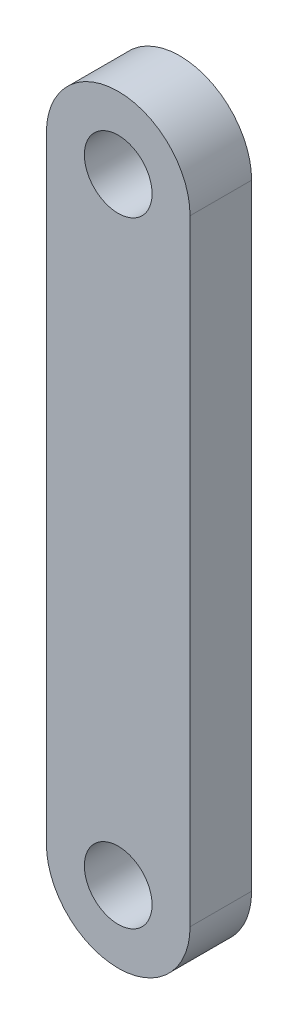
ISO-10303-21;
HEADER;
FILE_DESCRIPTION(('STEP AP214'),'2;1');
FILE_NAME('part.step','',(''),(''),'','','');
FILE_SCHEMA(('AUTOMOTIVE_DESIGN { 1 0 10303 214 1 1 1 1 }'));
ENDSEC;
DATA;
#1=APPLICATION_CONTEXT('core data for automotive mechanical design processes');
#2=APPLICATION_PROTOCOL_DEFINITION('international standard','automotive_design',2000,#1);
#3=PRODUCT_CONTEXT('',#1,'mechanical');
#4=PRODUCT('Part','Part','',(#3));
#5=PRODUCT_RELATED_PRODUCT_CATEGORY('part','',(#4));
#6=PRODUCT_DEFINITION_FORMATION('','',#4);
#7=PRODUCT_DEFINITION_CONTEXT('part definition',#1,'design');
#8=PRODUCT_DEFINITION('design','',#6,#7);
#9=PRODUCT_DEFINITION_SHAPE('','',#8);
#10=(LENGTH_UNIT() NAMED_UNIT(*) SI_UNIT(.MILLI.,.METRE.));
#11=(NAMED_UNIT(*) PLANE_ANGLE_UNIT() SI_UNIT($,.RADIAN.));
#12=(NAMED_UNIT(*) SI_UNIT($,.STERADIAN.) SOLID_ANGLE_UNIT());
#13=UNCERTAINTY_MEASURE_WITH_UNIT(LENGTH_MEASURE(1.E-05),#10,'distance_accuracy_value','');
#14=(GEOMETRIC_REPRESENTATION_CONTEXT(3) GLOBAL_UNCERTAINTY_ASSIGNED_CONTEXT((#13)) GLOBAL_UNIT_ASSIGNED_CONTEXT((#10,
#11,#12)) REPRESENTATION_CONTEXT('',''));
#15=CARTESIAN_POINT('',(0.,0.,0.));
#16=DIRECTION('',(0.,0.,1.));
#17=DIRECTION('',(1.,0.,0.));
#18=AXIS2_PLACEMENT_3D('',#15,#16,#17);
#19=CARTESIAN_POINT('',(0.,15.,3.));
#20=DIRECTION('',(0.,0.,1.));
#21=DIRECTION('',(1.,0.,0.));
#22=AXIS2_PLACEMENT_3D('',#19,#20,#21);
#23=PLANE('',#22);
#24=CARTESIAN_POINT('',(0.,15.,3.));
#25=DIRECTION('',(0.,0.,1.));
#26=DIRECTION('',(1.,0.,0.));
#27=AXIS2_PLACEMENT_3D('',#24,#25,#26);
#28=CIRCLE('',#27,1.65);
#29=CARTESIAN_POINT('',(1.64999999999999,15.,3.));
#30=VERTEX_POINT('',#29);
#31=EDGE_CURVE('E116',#30,#30,#28,.T.);
#32=ORIENTED_EDGE('',*,*,#31,.F.);
#33=EDGE_LOOP('',(#32));
#34=FACE_BOUND('',#33,.T.);
#35=CARTESIAN_POINT('',(0.,15.,3.));
#36=DIRECTION('',(0.,0.,1.));
#37=DIRECTION('',(1.,0.,0.));
#38=AXIS2_PLACEMENT_3D('',#35,#36,#37);
#39=CIRCLE('',#38,3.5);
#40=CARTESIAN_POINT('',(3.49999999999999,15.,3.));
#41=VERTEX_POINT('',#40);
#42=CARTESIAN_POINT('',(-3.50000000000001,15.,3.));
#43=VERTEX_POINT('',#42);
#44=EDGE_CURVE('E96',#41,#43,#39,.T.);
#45=ORIENTED_EDGE('',*,*,#44,.T.);
#46=DIRECTION('',(0.,-1.,0.));
#47=VECTOR('',#46,1.);
#48=CARTESIAN_POINT('',(-3.50000000000001,15.,3.));
#49=LINE('',#48,#47);
#50=CARTESIAN_POINT('',(-3.5,-15.,3.));
#51=VERTEX_POINT('',#50);
#52=EDGE_CURVE('E91',#43,#51,#49,.T.);
#53=ORIENTED_EDGE('',*,*,#52,.T.);
#54=CARTESIAN_POINT('',(0.,-15.,3.));
#55=DIRECTION('',(0.,0.,1.));
#56=DIRECTION('',(1.,0.,0.));
#57=AXIS2_PLACEMENT_3D('',#54,#55,#56);
#58=CIRCLE('',#57,3.5);
#59=CARTESIAN_POINT('',(3.5,-15.,3.));
#60=VERTEX_POINT('',#59);
#61=EDGE_CURVE('E94',#51,#60,#58,.T.);
#62=ORIENTED_EDGE('',*,*,#61,.T.);
#63=DIRECTION('',(0.,1.,0.));
#64=VECTOR('',#63,1.);
#65=CARTESIAN_POINT('',(3.49999999999999,15.,3.));
#66=LINE('',#65,#64);
#67=EDGE_CURVE('E61',#60,#41,#66,.T.);
#68=ORIENTED_EDGE('',*,*,#67,.T.);
#69=EDGE_LOOP('',(#45,#53,#62,#68));
#70=FACE_BOUND('',#69,.T.);
#71=CARTESIAN_POINT('',(0.,-15.,3.));
#72=DIRECTION('',(0.,0.,1.));
#73=DIRECTION('',(1.,0.,0.));
#74=AXIS2_PLACEMENT_3D('',#71,#72,#73);
#75=CIRCLE('',#74,1.65);
#76=CARTESIAN_POINT('',(1.65,-15.,3.));
#77=VERTEX_POINT('',#76);
#78=EDGE_CURVE('E138',#77,#77,#75,.T.);
#79=ORIENTED_EDGE('',*,*,#78,.F.);
#80=EDGE_LOOP('',(#79));
#81=FACE_BOUND('',#80,.T.);
#82=ADVANCED_FACE('F43',(#34,#70,#81),#23,.T.);
#83=CARTESIAN_POINT('',(0.,15.,0.));
#84=DIRECTION('',(0.,0.,1.));
#85=DIRECTION('',(1.,0.,0.));
#86=AXIS2_PLACEMENT_3D('',#83,#84,#85);
#87=PLANE('',#86);
#88=CARTESIAN_POINT('',(0.,15.,0.));
#89=DIRECTION('',(0.,0.,1.));
#90=DIRECTION('',(1.,0.,0.));
#91=AXIS2_PLACEMENT_3D('',#88,#89,#90);
#92=CIRCLE('',#91,3.5);
#93=CARTESIAN_POINT('',(3.49999999999999,15.,0.));
#94=VERTEX_POINT('',#93);
#95=CARTESIAN_POINT('',(-3.50000000000001,15.,0.));
#96=VERTEX_POINT('',#95);
#97=EDGE_CURVE('E112',#94,#96,#92,.T.);
#98=ORIENTED_EDGE('',*,*,#97,.F.);
#99=DIRECTION('',(0.,1.,0.));
#100=VECTOR('',#99,1.);
#101=CARTESIAN_POINT('',(3.49999999999999,15.,0.));
#102=LINE('',#101,#100);
#103=CARTESIAN_POINT('',(3.5,-15.,0.));
#104=VERTEX_POINT('',#103);
#105=EDGE_CURVE('E84',#104,#94,#102,.T.);
#106=ORIENTED_EDGE('',*,*,#105,.F.);
#107=CARTESIAN_POINT('',(0.,-15.,0.));
#108=DIRECTION('',(0.,0.,1.));
#109=DIRECTION('',(1.,0.,0.));
#110=AXIS2_PLACEMENT_3D('',#107,#108,#109);
#111=CIRCLE('',#110,3.5);
#112=CARTESIAN_POINT('',(-3.5,-15.,0.));
#113=VERTEX_POINT('',#112);
#114=EDGE_CURVE('E78',#113,#104,#111,.T.);
#115=ORIENTED_EDGE('',*,*,#114,.F.);
#116=DIRECTION('',(0.,-1.,0.));
#117=VECTOR('',#116,1.);
#118=CARTESIAN_POINT('',(-3.50000000000001,15.,0.));
#119=LINE('',#118,#117);
#120=EDGE_CURVE('E101',#96,#113,#119,.T.);
#121=ORIENTED_EDGE('',*,*,#120,.F.);
#122=EDGE_LOOP('',(#98,#106,#115,#121));
#123=FACE_BOUND('',#122,.T.);
#124=CARTESIAN_POINT('',(0.,15.,0.));
#125=DIRECTION('',(0.,0.,1.));
#126=DIRECTION('',(1.,0.,0.));
#127=AXIS2_PLACEMENT_3D('',#124,#125,#126);
#128=CIRCLE('',#127,1.65);
#129=CARTESIAN_POINT('',(1.64999999999999,15.,0.));
#130=VERTEX_POINT('',#129);
#131=EDGE_CURVE('E134',#130,#130,#128,.T.);
#132=ORIENTED_EDGE('',*,*,#131,.T.);
#133=EDGE_LOOP('',(#132));
#134=FACE_BOUND('',#133,.T.);
#135=CARTESIAN_POINT('',(0.,-15.,0.));
#136=DIRECTION('',(0.,0.,1.));
#137=DIRECTION('',(1.,0.,0.));
#138=AXIS2_PLACEMENT_3D('',#135,#136,#137);
#139=CIRCLE('',#138,1.65);
#140=CARTESIAN_POINT('',(1.65,-15.,0.));
#141=VERTEX_POINT('',#140);
#142=EDGE_CURVE('E142',#141,#141,#139,.T.);
#143=ORIENTED_EDGE('',*,*,#142,.T.);
#144=EDGE_LOOP('',(#143));
#145=FACE_BOUND('',#144,.T.);
#146=ADVANCED_FACE('F129',(#123,#134,#145),#87,.F.);
#147=CARTESIAN_POINT('',(0.,15.,3.));
#148=DIRECTION('',(0.,0.,-1.));
#149=DIRECTION('',(-1.,0.,0.));
#150=AXIS2_PLACEMENT_3D('',#147,#148,#149);
#151=CYLINDRICAL_SURFACE('',#150,3.5);
#152=ORIENTED_EDGE('',*,*,#97,.T.);
#153=DIRECTION('',(0.,0.,-1.));
#154=VECTOR('',#153,1.);
#155=CARTESIAN_POINT('',(-3.50000000000001,15.,3.));
#156=LINE('',#155,#154);
#157=EDGE_CURVE('E11',#43,#96,#156,.T.);
#158=ORIENTED_EDGE('',*,*,#157,.F.);
#159=ORIENTED_EDGE('',*,*,#44,.F.);
#160=DIRECTION('',(0.,0.,-1.));
#161=VECTOR('',#160,1.);
#162=CARTESIAN_POINT('',(3.49999999999999,15.,3.));
#163=LINE('',#162,#161);
#164=EDGE_CURVE('E108',#41,#94,#163,.T.);
#165=ORIENTED_EDGE('',*,*,#164,.T.);
#166=EDGE_LOOP('',(#152,#158,#159,#165));
#167=FACE_BOUND('',#166,.T.);
#168=ADVANCED_FACE('F45',(#167),#151,.T.);
#169=CARTESIAN_POINT('',(-3.50000000000001,15.,3.));
#170=DIRECTION('',(1.,0.,0.));
#171=DIRECTION('',(0.,1.,0.));
#172=AXIS2_PLACEMENT_3D('',#169,#170,#171);
#173=PLANE('',#172);
#174=ORIENTED_EDGE('',*,*,#120,.T.);
#175=DIRECTION('',(0.,0.,-1.));
#176=VECTOR('',#175,1.);
#177=CARTESIAN_POINT('',(-3.5,-15.,3.));
#178=LINE('',#177,#176);
#179=EDGE_CURVE('E53',#51,#113,#178,.T.);
#180=ORIENTED_EDGE('',*,*,#179,.F.);
#181=ORIENTED_EDGE('',*,*,#52,.F.);
#182=ORIENTED_EDGE('',*,*,#157,.T.);
#183=EDGE_LOOP('',(#174,#180,#181,#182));
#184=FACE_BOUND('',#183,.T.);
#185=ADVANCED_FACE('F100',(#184),#173,.F.);
#186=CARTESIAN_POINT('',(0.,-15.,3.));
#187=DIRECTION('',(0.,0.,-1.));
#188=DIRECTION('',(-1.,0.,0.));
#189=AXIS2_PLACEMENT_3D('',#186,#187,#188);
#190=CYLINDRICAL_SURFACE('',#189,3.5);
#191=ORIENTED_EDGE('',*,*,#114,.T.);
#192=DIRECTION('',(0.,0.,-1.));
#193=VECTOR('',#192,1.);
#194=CARTESIAN_POINT('',(3.5,-15.,3.));
#195=LINE('',#194,#193);
#196=EDGE_CURVE('E103',#60,#104,#195,.T.);
#197=ORIENTED_EDGE('',*,*,#196,.F.);
#198=ORIENTED_EDGE('',*,*,#61,.F.);
#199=ORIENTED_EDGE('',*,*,#179,.T.);
#200=EDGE_LOOP('',(#191,#197,#198,#199));
#201=FACE_BOUND('',#200,.T.);
#202=ADVANCED_FACE('F104',(#201),#190,.T.);
#203=CARTESIAN_POINT('',(3.49999999999999,15.,3.));
#204=DIRECTION('',(-1.,0.,0.));
#205=DIRECTION('',(0.,-1.,0.));
#206=AXIS2_PLACEMENT_3D('',#203,#204,#205);
#207=PLANE('',#206);
#208=ORIENTED_EDGE('',*,*,#105,.T.);
#209=ORIENTED_EDGE('',*,*,#164,.F.);
#210=ORIENTED_EDGE('',*,*,#67,.F.);
#211=ORIENTED_EDGE('',*,*,#196,.T.);
#212=EDGE_LOOP('',(#208,#209,#210,#211));
#213=FACE_BOUND('',#212,.T.);
#214=ADVANCED_FACE('F126',(#213),#207,.F.);
#215=CARTESIAN_POINT('',(0.,15.,3.));
#216=DIRECTION('',(0.,0.,-1.));
#217=DIRECTION('',(-1.,0.,0.));
#218=AXIS2_PLACEMENT_3D('',#215,#216,#217);
#219=CYLINDRICAL_SURFACE('',#218,1.65);
#220=ORIENTED_EDGE('',*,*,#31,.T.);
#221=EDGE_LOOP('',(#220));
#222=FACE_BOUND('',#221,.T.);
#223=ORIENTED_EDGE('',*,*,#131,.F.);
#224=EDGE_LOOP('',(#223));
#225=FACE_BOUND('',#224,.T.);
#226=ADVANCED_FACE('F161',(#222,#225),#219,.F.);
#227=CARTESIAN_POINT('',(0.,-15.,3.));
#228=DIRECTION('',(0.,0.,-1.));
#229=DIRECTION('',(-1.,0.,0.));
#230=AXIS2_PLACEMENT_3D('',#227,#228,#229);
#231=CYLINDRICAL_SURFACE('',#230,1.65);
#232=ORIENTED_EDGE('',*,*,#78,.T.);
#233=EDGE_LOOP('',(#232));
#234=FACE_BOUND('',#233,.T.);
#235=ORIENTED_EDGE('',*,*,#142,.F.);
#236=EDGE_LOOP('',(#235));
#237=FACE_BOUND('',#236,.T.);
#238=ADVANCED_FACE('F150',(#234,#237),#231,.F.);
#239=CLOSED_SHELL('',(#82,#146,#168,#185,#202,#214,#226,#238));
#240=MANIFOLD_SOLID_BREP('B2',#239);
#241=ADVANCED_BREP_SHAPE_REPRESENTATION('',(#18,#240),#14);
#242=SHAPE_DEFINITION_REPRESENTATION(#9,#241);
ENDSEC;
END-ISO-10303-21;
